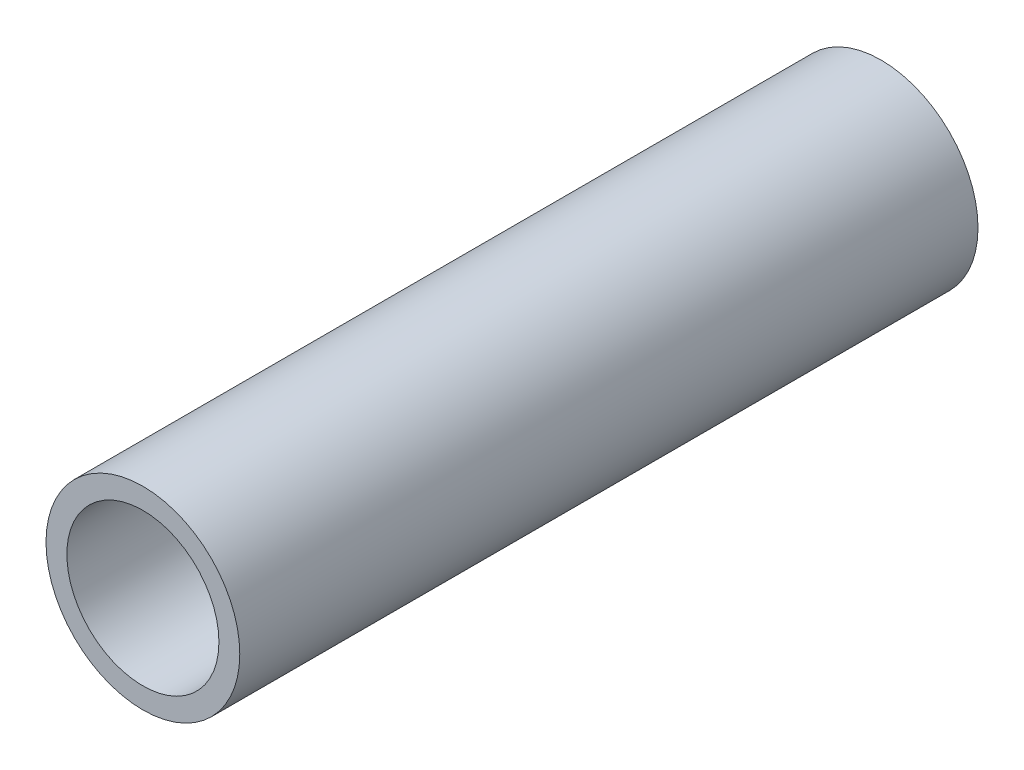
ISO-10303-21;
HEADER;
FILE_DESCRIPTION(('STEP AP214'),'2;1');
FILE_NAME('part.step','',(''),(''),'','','');
FILE_SCHEMA(('AUTOMOTIVE_DESIGN { 1 0 10303 214 1 1 1 1 }'));
ENDSEC;
DATA;
#1=APPLICATION_CONTEXT('core data for automotive mechanical design processes');
#2=APPLICATION_PROTOCOL_DEFINITION('international standard','automotive_design',2000,#1);
#3=PRODUCT_CONTEXT('',#1,'mechanical');
#4=PRODUCT('Part','Part','',(#3));
#5=PRODUCT_RELATED_PRODUCT_CATEGORY('part','',(#4));
#6=PRODUCT_DEFINITION_FORMATION('','',#4);
#7=PRODUCT_DEFINITION_CONTEXT('part definition',#1,'design');
#8=PRODUCT_DEFINITION('design','',#6,#7);
#9=PRODUCT_DEFINITION_SHAPE('','',#8);
#10=(LENGTH_UNIT() NAMED_UNIT(*) SI_UNIT(.MILLI.,.METRE.));
#11=(NAMED_UNIT(*) PLANE_ANGLE_UNIT() SI_UNIT($,.RADIAN.));
#12=(NAMED_UNIT(*) SI_UNIT($,.STERADIAN.) SOLID_ANGLE_UNIT());
#13=UNCERTAINTY_MEASURE_WITH_UNIT(LENGTH_MEASURE(1.E-05),#10,'distance_accuracy_value','');
#14=(GEOMETRIC_REPRESENTATION_CONTEXT(3) GLOBAL_UNCERTAINTY_ASSIGNED_CONTEXT((#13)) GLOBAL_UNIT_ASSIGNED_CONTEXT((#10,
#11,#12)) REPRESENTATION_CONTEXT('',''));
#15=CARTESIAN_POINT('',(0.,0.,0.));
#16=DIRECTION('',(0.,0.,1.));
#17=DIRECTION('',(1.,0.,0.));
#18=AXIS2_PLACEMENT_3D('',#15,#16,#17);
#19=CARTESIAN_POINT('',(0.,0.,101.6));
#20=DIRECTION('',(0.,0.,1.));
#21=DIRECTION('',(1.,0.,0.));
#22=AXIS2_PLACEMENT_3D('',#19,#20,#21);
#23=PLANE('',#22);
#24=CARTESIAN_POINT('',(0.,0.,101.6));
#25=DIRECTION('',(0.,0.,1.));
#26=DIRECTION('',(1.,0.,0.));
#27=AXIS2_PLACEMENT_3D('',#24,#25,#26);
#28=CIRCLE('',#27,13.335);
#29=CARTESIAN_POINT('',(13.335,0.,101.6));
#30=VERTEX_POINT('',#29);
#31=EDGE_CURVE('E10',#30,#30,#28,.T.);
#32=ORIENTED_EDGE('',*,*,#31,.T.);
#33=EDGE_LOOP('',(#32));
#34=FACE_BOUND('',#33,.T.);
#35=CARTESIAN_POINT('',(0.,0.,101.6));
#36=DIRECTION('',(0.,0.,1.));
#37=DIRECTION('',(1.,0.,0.));
#38=AXIS2_PLACEMENT_3D('',#35,#36,#37);
#39=CIRCLE('',#38,10.4648);
#40=CARTESIAN_POINT('',(10.4648,0.,101.6));
#41=VERTEX_POINT('',#40);
#42=EDGE_CURVE('E46',#41,#41,#39,.T.);
#43=ORIENTED_EDGE('',*,*,#42,.F.);
#44=EDGE_LOOP('',(#43));
#45=FACE_BOUND('',#44,.T.);
#46=ADVANCED_FACE('F35',(#34,#45),#23,.T.);
#47=CARTESIAN_POINT('',(0.,0.,0.));
#48=DIRECTION('',(0.,0.,1.));
#49=DIRECTION('',(1.,0.,0.));
#50=AXIS2_PLACEMENT_3D('',#47,#48,#49);
#51=PLANE('',#50);
#52=CARTESIAN_POINT('',(0.,0.,0.));
#53=DIRECTION('',(0.,0.,1.));
#54=DIRECTION('',(1.,0.,0.));
#55=AXIS2_PLACEMENT_3D('',#52,#53,#54);
#56=CIRCLE('',#55,13.335);
#57=CARTESIAN_POINT('',(13.335,0.,0.));
#58=VERTEX_POINT('',#57);
#59=EDGE_CURVE('E39',#58,#58,#56,.T.);
#60=ORIENTED_EDGE('',*,*,#59,.F.);
#61=EDGE_LOOP('',(#60));
#62=FACE_BOUND('',#61,.T.);
#63=CARTESIAN_POINT('',(0.,0.,0.));
#64=DIRECTION('',(0.,0.,1.));
#65=DIRECTION('',(1.,0.,0.));
#66=AXIS2_PLACEMENT_3D('',#63,#64,#65);
#67=CIRCLE('',#66,10.4648);
#68=CARTESIAN_POINT('',(10.4648,0.,0.));
#69=VERTEX_POINT('',#68);
#70=EDGE_CURVE('E48',#69,#69,#67,.T.);
#71=ORIENTED_EDGE('',*,*,#70,.T.);
#72=EDGE_LOOP('',(#71));
#73=FACE_BOUND('',#72,.T.);
#74=ADVANCED_FACE('F58',(#62,#73),#51,.F.);
#75=CARTESIAN_POINT('',(0.,0.,101.6));
#76=DIRECTION('',(0.,0.,-1.));
#77=DIRECTION('',(-1.,0.,0.));
#78=AXIS2_PLACEMENT_3D('',#75,#76,#77);
#79=CYLINDRICAL_SURFACE('',#78,13.335);
#80=ORIENTED_EDGE('',*,*,#31,.F.);
#81=EDGE_LOOP('',(#80));
#82=FACE_BOUND('',#81,.T.);
#83=ORIENTED_EDGE('',*,*,#59,.T.);
#84=EDGE_LOOP('',(#83));
#85=FACE_BOUND('',#84,.T.);
#86=ADVANCED_FACE('F37',(#82,#85),#79,.T.);
#87=CARTESIAN_POINT('',(0.,0.,101.6));
#88=DIRECTION('',(0.,0.,-1.));
#89=DIRECTION('',(-1.,0.,0.));
#90=AXIS2_PLACEMENT_3D('',#87,#88,#89);
#91=CYLINDRICAL_SURFACE('',#90,10.4648);
#92=ORIENTED_EDGE('',*,*,#42,.T.);
#93=EDGE_LOOP('',(#92));
#94=FACE_BOUND('',#93,.T.);
#95=ORIENTED_EDGE('',*,*,#70,.F.);
#96=EDGE_LOOP('',(#95));
#97=FACE_BOUND('',#96,.T.);
#98=ADVANCED_FACE('F54',(#94,#97),#91,.F.);
#99=CLOSED_SHELL('',(#46,#74,#86,#98));
#100=MANIFOLD_SOLID_BREP('B2',#99);
#101=ADVANCED_BREP_SHAPE_REPRESENTATION('',(#18,#100),#14);
#102=SHAPE_DEFINITION_REPRESENTATION(#9,#101);
ENDSEC;
END-ISO-10303-21;
